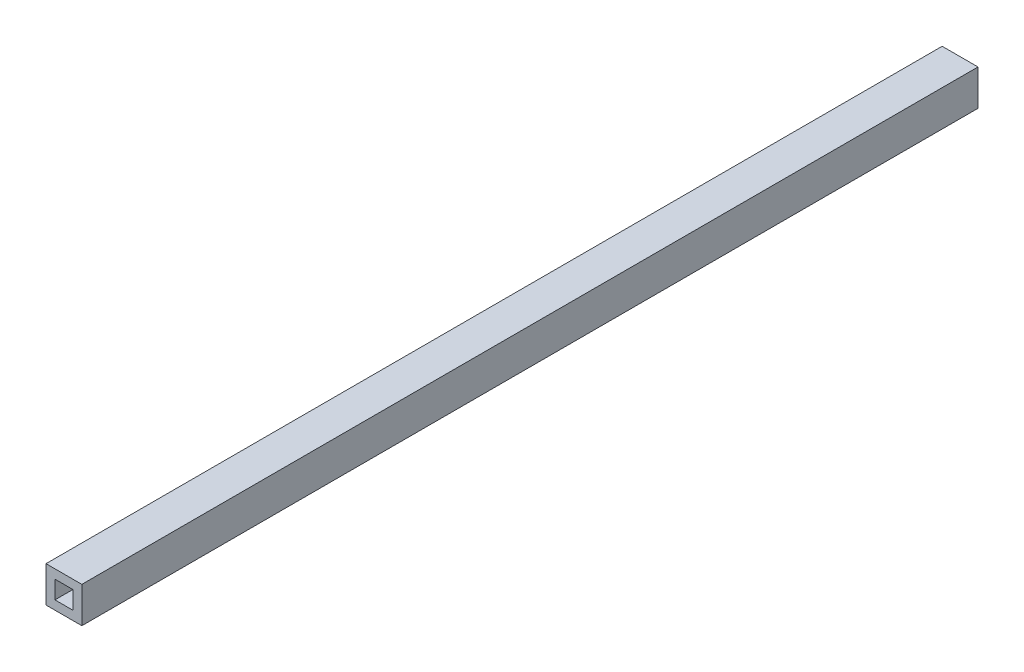
ISO-10303-21;
HEADER;
FILE_DESCRIPTION(('STEP AP214'),'2;1');
FILE_NAME('part.step','',(''),(''),'','','');
FILE_SCHEMA(('AUTOMOTIVE_DESIGN { 1 0 10303 214 1 1 1 1 }'));
ENDSEC;
DATA;
#1=APPLICATION_CONTEXT('core data for automotive mechanical design processes');
#2=APPLICATION_PROTOCOL_DEFINITION('international standard','automotive_design',2000,#1);
#3=PRODUCT_CONTEXT('',#1,'mechanical');
#4=PRODUCT('Part','Part','',(#3));
#5=PRODUCT_RELATED_PRODUCT_CATEGORY('part','',(#4));
#6=PRODUCT_DEFINITION_FORMATION('','',#4);
#7=PRODUCT_DEFINITION_CONTEXT('part definition',#1,'design');
#8=PRODUCT_DEFINITION('design','',#6,#7);
#9=PRODUCT_DEFINITION_SHAPE('','',#8);
#10=(LENGTH_UNIT() NAMED_UNIT(*) SI_UNIT(.MILLI.,.METRE.));
#11=(NAMED_UNIT(*) PLANE_ANGLE_UNIT() SI_UNIT($,.RADIAN.));
#12=(NAMED_UNIT(*) SI_UNIT($,.STERADIAN.) SOLID_ANGLE_UNIT());
#13=UNCERTAINTY_MEASURE_WITH_UNIT(LENGTH_MEASURE(1.E-05),#10,'distance_accuracy_value','');
#14=(GEOMETRIC_REPRESENTATION_CONTEXT(3) GLOBAL_UNCERTAINTY_ASSIGNED_CONTEXT((#13)) GLOBAL_UNIT_ASSIGNED_CONTEXT((#10,
#11,#12)) REPRESENTATION_CONTEXT('',''));
#15=CARTESIAN_POINT('',(0.,0.,0.));
#16=DIRECTION('',(0.,0.,1.));
#17=DIRECTION('',(1.,0.,0.));
#18=AXIS2_PLACEMENT_3D('',#15,#16,#17);
#19=CARTESIAN_POINT('',(0.,0.,500.));
#20=DIRECTION('',(0.,0.,1.));
#21=DIRECTION('',(1.,0.,0.));
#22=AXIS2_PLACEMENT_3D('',#19,#20,#21);
#23=PLANE('',#22);
#24=DIRECTION('',(0.,1.,0.));
#25=VECTOR('',#24,1.);
#26=CARTESIAN_POINT('',(10.,-10.,500.));
#27=LINE('',#26,#25);
#28=CARTESIAN_POINT('',(10.,-10.,500.));
#29=VERTEX_POINT('',#28);
#30=CARTESIAN_POINT('',(10.,10.,500.));
#31=VERTEX_POINT('',#30);
#32=EDGE_CURVE('E158',#29,#31,#27,.T.);
#33=ORIENTED_EDGE('',*,*,#32,.T.);
#34=DIRECTION('',(-1.,0.,0.));
#35=VECTOR('',#34,1.);
#36=CARTESIAN_POINT('',(-10.,10.,500.));
#37=LINE('',#36,#35);
#38=CARTESIAN_POINT('',(-10.,10.,500.));
#39=VERTEX_POINT('',#38);
#40=EDGE_CURVE('E161',#31,#39,#37,.T.);
#41=ORIENTED_EDGE('',*,*,#40,.T.);
#42=DIRECTION('',(0.,-1.,0.));
#43=VECTOR('',#42,1.);
#44=CARTESIAN_POINT('',(-10.,-10.,500.));
#45=LINE('',#44,#43);
#46=CARTESIAN_POINT('',(-10.,-10.,500.));
#47=VERTEX_POINT('',#46);
#48=EDGE_CURVE('E164',#39,#47,#45,.T.);
#49=ORIENTED_EDGE('',*,*,#48,.T.);
#50=DIRECTION('',(1.,0.,0.));
#51=VECTOR('',#50,1.);
#52=CARTESIAN_POINT('',(-10.,-10.,500.));
#53=LINE('',#52,#51);
#54=EDGE_CURVE('E166',#47,#29,#53,.T.);
#55=ORIENTED_EDGE('',*,*,#54,.T.);
#56=EDGE_LOOP('',(#33,#41,#49,#55));
#57=FACE_BOUND('',#56,.T.);
#58=DIRECTION('',(-1.,0.,0.));
#59=VECTOR('',#58,1.);
#60=CARTESIAN_POINT('',(0.,5.,500.));
#61=LINE('',#60,#59);
#62=CARTESIAN_POINT('',(5.,5.,500.));
#63=VERTEX_POINT('',#62);
#64=CARTESIAN_POINT('',(-5.,5.,500.));
#65=VERTEX_POINT('',#64);
#66=EDGE_CURVE('E130',#63,#65,#61,.T.);
#67=ORIENTED_EDGE('',*,*,#66,.F.);
#68=DIRECTION('',(0.,1.,0.));
#69=VECTOR('',#68,1.);
#70=CARTESIAN_POINT('',(5.,0.,500.));
#71=LINE('',#70,#69);
#72=CARTESIAN_POINT('',(5.,-5.,500.));
#73=VERTEX_POINT('',#72);
#74=EDGE_CURVE('E122',#73,#63,#71,.T.);
#75=ORIENTED_EDGE('',*,*,#74,.F.);
#76=DIRECTION('',(1.,0.,0.));
#77=VECTOR('',#76,1.);
#78=CARTESIAN_POINT('',(0.,-5.,500.));
#79=LINE('',#78,#77);
#80=CARTESIAN_POINT('',(-5.,-5.,500.));
#81=VERTEX_POINT('',#80);
#82=EDGE_CURVE('E144',#81,#73,#79,.T.);
#83=ORIENTED_EDGE('',*,*,#82,.F.);
#84=DIRECTION('',(0.,-1.,0.));
#85=VECTOR('',#84,1.);
#86=CARTESIAN_POINT('',(-5.,0.,500.));
#87=LINE('',#86,#85);
#88=EDGE_CURVE('E142',#65,#81,#87,.T.);
#89=ORIENTED_EDGE('',*,*,#88,.F.);
#90=EDGE_LOOP('',(#67,#75,#83,#89));
#91=FACE_BOUND('',#90,.T.);
#92=ADVANCED_FACE('F57',(#57,#91),#23,.T.);
#93=CARTESIAN_POINT('',(0.,0.,0.));
#94=DIRECTION('',(0.,0.,1.));
#95=DIRECTION('',(1.,0.,0.));
#96=AXIS2_PLACEMENT_3D('',#93,#94,#95);
#97=PLANE('',#96);
#98=DIRECTION('',(0.,1.,0.));
#99=VECTOR('',#98,1.);
#100=CARTESIAN_POINT('',(10.,-10.,0.));
#101=LINE('',#100,#99);
#102=CARTESIAN_POINT('',(10.,-10.,0.));
#103=VERTEX_POINT('',#102);
#104=CARTESIAN_POINT('',(10.,10.,0.));
#105=VERTEX_POINT('',#104);
#106=EDGE_CURVE('E138',#103,#105,#101,.T.);
#107=ORIENTED_EDGE('',*,*,#106,.F.);
#108=DIRECTION('',(1.,0.,0.));
#109=VECTOR('',#108,1.);
#110=CARTESIAN_POINT('',(-10.,-10.,0.));
#111=LINE('',#110,#109);
#112=CARTESIAN_POINT('',(-10.,-10.,0.));
#113=VERTEX_POINT('',#112);
#114=EDGE_CURVE('E162',#113,#103,#111,.T.);
#115=ORIENTED_EDGE('',*,*,#114,.F.);
#116=DIRECTION('',(0.,-1.,0.));
#117=VECTOR('',#116,1.);
#118=CARTESIAN_POINT('',(-10.,-10.,0.));
#119=LINE('',#118,#117);
#120=CARTESIAN_POINT('',(-10.,10.,0.));
#121=VERTEX_POINT('',#120);
#122=EDGE_CURVE('E173',#121,#113,#119,.T.);
#123=ORIENTED_EDGE('',*,*,#122,.F.);
#124=DIRECTION('',(-1.,0.,0.));
#125=VECTOR('',#124,1.);
#126=CARTESIAN_POINT('',(-10.,10.,0.));
#127=LINE('',#126,#125);
#128=EDGE_CURVE('E171',#105,#121,#127,.T.);
#129=ORIENTED_EDGE('',*,*,#128,.F.);
#130=EDGE_LOOP('',(#107,#115,#123,#129));
#131=FACE_BOUND('',#130,.T.);
#132=DIRECTION('',(0.,1.,0.));
#133=VECTOR('',#132,1.);
#134=CARTESIAN_POINT('',(5.,0.,0.));
#135=LINE('',#134,#133);
#136=CARTESIAN_POINT('',(5.,-5.,0.));
#137=VERTEX_POINT('',#136);
#138=CARTESIAN_POINT('',(5.,5.,0.));
#139=VERTEX_POINT('',#138);
#140=EDGE_CURVE('E80',#137,#139,#135,.T.);
#141=ORIENTED_EDGE('',*,*,#140,.T.);
#142=DIRECTION('',(-1.,0.,0.));
#143=VECTOR('',#142,1.);
#144=CARTESIAN_POINT('',(0.,5.,0.));
#145=LINE('',#144,#143);
#146=CARTESIAN_POINT('',(-5.,5.,0.));
#147=VERTEX_POINT('',#146);
#148=EDGE_CURVE('E137',#139,#147,#145,.T.);
#149=ORIENTED_EDGE('',*,*,#148,.T.);
#150=DIRECTION('',(0.,-1.,0.));
#151=VECTOR('',#150,1.);
#152=CARTESIAN_POINT('',(-5.,0.,0.));
#153=LINE('',#152,#151);
#154=CARTESIAN_POINT('',(-5.,-5.,0.));
#155=VERTEX_POINT('',#154);
#156=EDGE_CURVE('E150',#147,#155,#153,.T.);
#157=ORIENTED_EDGE('',*,*,#156,.T.);
#158=DIRECTION('',(1.,0.,0.));
#159=VECTOR('',#158,1.);
#160=CARTESIAN_POINT('',(0.,-5.,0.));
#161=LINE('',#160,#159);
#162=EDGE_CURVE('E131',#155,#137,#161,.T.);
#163=ORIENTED_EDGE('',*,*,#162,.T.);
#164=EDGE_LOOP('',(#141,#149,#157,#163));
#165=FACE_BOUND('',#164,.T.);
#166=ADVANCED_FACE('F191',(#131,#165),#97,.F.);
#167=CARTESIAN_POINT('',(10.,-10.,500.));
#168=DIRECTION('',(-1.,0.,0.));
#169=DIRECTION('',(0.,0.,1.));
#170=AXIS2_PLACEMENT_3D('',#167,#168,#169);
#171=PLANE('',#170);
#172=ORIENTED_EDGE('',*,*,#106,.T.);
#173=DIRECTION('',(0.,0.,-1.));
#174=VECTOR('',#173,1.);
#175=CARTESIAN_POINT('',(10.,10.,500.));
#176=LINE('',#175,#174);
#177=EDGE_CURVE('E12',#31,#105,#176,.T.);
#178=ORIENTED_EDGE('',*,*,#177,.F.);
#179=ORIENTED_EDGE('',*,*,#32,.F.);
#180=DIRECTION('',(0.,0.,-1.));
#181=VECTOR('',#180,1.);
#182=CARTESIAN_POINT('',(10.,-10.,500.));
#183=LINE('',#182,#181);
#184=EDGE_CURVE('E168',#29,#103,#183,.T.);
#185=ORIENTED_EDGE('',*,*,#184,.T.);
#186=EDGE_LOOP('',(#172,#178,#179,#185));
#187=FACE_BOUND('',#186,.T.);
#188=ADVANCED_FACE('F59',(#187),#171,.F.);
#189=CARTESIAN_POINT('',(-10.,10.,500.));
#190=DIRECTION('',(0.,-1.,0.));
#191=DIRECTION('',(0.,0.,-1.));
#192=AXIS2_PLACEMENT_3D('',#189,#190,#191);
#193=PLANE('',#192);
#194=ORIENTED_EDGE('',*,*,#128,.T.);
#195=DIRECTION('',(0.,0.,-1.));
#196=VECTOR('',#195,1.);
#197=CARTESIAN_POINT('',(-10.,10.,500.));
#198=LINE('',#197,#196);
#199=EDGE_CURVE('E65',#39,#121,#198,.T.);
#200=ORIENTED_EDGE('',*,*,#199,.F.);
#201=ORIENTED_EDGE('',*,*,#40,.F.);
#202=ORIENTED_EDGE('',*,*,#177,.T.);
#203=EDGE_LOOP('',(#194,#200,#201,#202));
#204=FACE_BOUND('',#203,.T.);
#205=ADVANCED_FACE('F201',(#204),#193,.F.);
#206=CARTESIAN_POINT('',(-10.,-10.,500.));
#207=DIRECTION('',(1.,0.,0.));
#208=DIRECTION('',(0.,0.,-1.));
#209=AXIS2_PLACEMENT_3D('',#206,#207,#208);
#210=PLANE('',#209);
#211=ORIENTED_EDGE('',*,*,#122,.T.);
#212=DIRECTION('',(0.,0.,-1.));
#213=VECTOR('',#212,1.);
#214=CARTESIAN_POINT('',(-10.,-10.,500.));
#215=LINE('',#214,#213);
#216=EDGE_CURVE('E178',#47,#113,#215,.T.);
#217=ORIENTED_EDGE('',*,*,#216,.F.);
#218=ORIENTED_EDGE('',*,*,#48,.F.);
#219=ORIENTED_EDGE('',*,*,#199,.T.);
#220=EDGE_LOOP('',(#211,#217,#218,#219));
#221=FACE_BOUND('',#220,.T.);
#222=ADVANCED_FACE('F185',(#221),#210,.F.);
#223=CARTESIAN_POINT('',(-10.,-10.,500.));
#224=DIRECTION('',(0.,1.,0.));
#225=DIRECTION('',(0.,0.,1.));
#226=AXIS2_PLACEMENT_3D('',#223,#224,#225);
#227=PLANE('',#226);
#228=ORIENTED_EDGE('',*,*,#114,.T.);
#229=ORIENTED_EDGE('',*,*,#184,.F.);
#230=ORIENTED_EDGE('',*,*,#54,.F.);
#231=ORIENTED_EDGE('',*,*,#216,.T.);
#232=EDGE_LOOP('',(#228,#229,#230,#231));
#233=FACE_BOUND('',#232,.T.);
#234=ADVANCED_FACE('F195',(#233),#227,.F.);
#235=CARTESIAN_POINT('',(5.,0.,500.));
#236=DIRECTION('',(-1.,0.,0.));
#237=DIRECTION('',(0.,0.,1.));
#238=AXIS2_PLACEMENT_3D('',#235,#236,#237);
#239=PLANE('',#238);
#240=ORIENTED_EDGE('',*,*,#140,.F.);
#241=DIRECTION('',(0.,0.,-1.));
#242=VECTOR('',#241,1.);
#243=CARTESIAN_POINT('',(5.,-5.,500.));
#244=LINE('',#243,#242);
#245=EDGE_CURVE('E126',#73,#137,#244,.T.);
#246=ORIENTED_EDGE('',*,*,#245,.F.);
#247=ORIENTED_EDGE('',*,*,#74,.T.);
#248=DIRECTION('',(0.,0.,-1.));
#249=VECTOR('',#248,1.);
#250=CARTESIAN_POINT('',(5.,5.,500.));
#251=LINE('',#250,#249);
#252=EDGE_CURVE('E125',#63,#139,#251,.T.);
#253=ORIENTED_EDGE('',*,*,#252,.T.);
#254=EDGE_LOOP('',(#240,#246,#247,#253));
#255=FACE_BOUND('',#254,.T.);
#256=ADVANCED_FACE('F124',(#255),#239,.T.);
#257=CARTESIAN_POINT('',(0.,5.,500.));
#258=DIRECTION('',(0.,-1.,0.));
#259=DIRECTION('',(0.,0.,-1.));
#260=AXIS2_PLACEMENT_3D('',#257,#258,#259);
#261=PLANE('',#260);
#262=ORIENTED_EDGE('',*,*,#148,.F.);
#263=ORIENTED_EDGE('',*,*,#252,.F.);
#264=ORIENTED_EDGE('',*,*,#66,.T.);
#265=DIRECTION('',(0.,0.,-1.));
#266=VECTOR('',#265,1.);
#267=CARTESIAN_POINT('',(-5.,5.,500.));
#268=LINE('',#267,#266);
#269=EDGE_CURVE('E139',#65,#147,#268,.T.);
#270=ORIENTED_EDGE('',*,*,#269,.T.);
#271=EDGE_LOOP('',(#262,#263,#264,#270));
#272=FACE_BOUND('',#271,.T.);
#273=ADVANCED_FACE('F134',(#272),#261,.T.);
#274=CARTESIAN_POINT('',(-5.,0.,500.));
#275=DIRECTION('',(1.,0.,0.));
#276=DIRECTION('',(0.,0.,-1.));
#277=AXIS2_PLACEMENT_3D('',#274,#275,#276);
#278=PLANE('',#277);
#279=ORIENTED_EDGE('',*,*,#156,.F.);
#280=ORIENTED_EDGE('',*,*,#269,.F.);
#281=ORIENTED_EDGE('',*,*,#88,.T.);
#282=DIRECTION('',(0.,0.,-1.));
#283=VECTOR('',#282,1.);
#284=CARTESIAN_POINT('',(-5.,-5.,500.));
#285=LINE('',#284,#283);
#286=EDGE_CURVE('E72',#81,#155,#285,.T.);
#287=ORIENTED_EDGE('',*,*,#286,.T.);
#288=EDGE_LOOP('',(#279,#280,#281,#287));
#289=FACE_BOUND('',#288,.T.);
#290=ADVANCED_FACE('F224',(#289),#278,.T.);
#291=CARTESIAN_POINT('',(0.,-5.,500.));
#292=DIRECTION('',(0.,1.,0.));
#293=DIRECTION('',(0.,0.,1.));
#294=AXIS2_PLACEMENT_3D('',#291,#292,#293);
#295=PLANE('',#294);
#296=ORIENTED_EDGE('',*,*,#162,.F.);
#297=ORIENTED_EDGE('',*,*,#286,.F.);
#298=ORIENTED_EDGE('',*,*,#82,.T.);
#299=ORIENTED_EDGE('',*,*,#245,.T.);
#300=EDGE_LOOP('',(#296,#297,#298,#299));
#301=FACE_BOUND('',#300,.T.);
#302=ADVANCED_FACE('F228',(#301),#295,.T.);
#303=CLOSED_SHELL('',(#92,#166,#188,#205,#222,#234,#256,#273,#290,#302));
#304=MANIFOLD_SOLID_BREP('B2',#303);
#305=ADVANCED_BREP_SHAPE_REPRESENTATION('',(#18,#304),#14);
#306=SHAPE_DEFINITION_REPRESENTATION(#9,#305);
ENDSEC;
END-ISO-10303-21;
